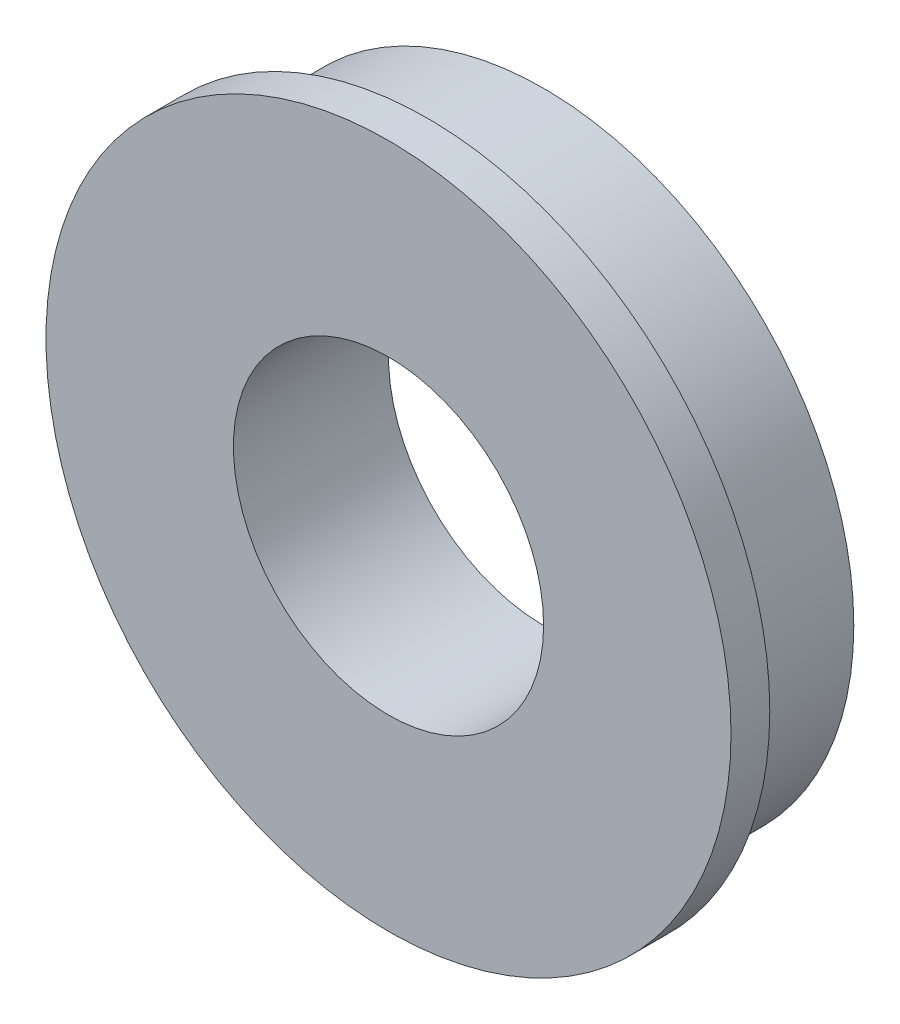
ISO-10303-21;
HEADER;
FILE_DESCRIPTION(('STEP AP214'),'2;1');
FILE_NAME('part.step','',(''),(''),'','','');
FILE_SCHEMA(('AUTOMOTIVE_DESIGN { 1 0 10303 214 1 1 1 1 }'));
ENDSEC;
DATA;
#1=APPLICATION_CONTEXT('core data for automotive mechanical design processes');
#2=APPLICATION_PROTOCOL_DEFINITION('international standard','automotive_design',2000,#1);
#3=PRODUCT_CONTEXT('',#1,'mechanical');
#4=PRODUCT('Part','Part','',(#3));
#5=PRODUCT_RELATED_PRODUCT_CATEGORY('part','',(#4));
#6=PRODUCT_DEFINITION_FORMATION('','',#4);
#7=PRODUCT_DEFINITION_CONTEXT('part definition',#1,'design');
#8=PRODUCT_DEFINITION('design','',#6,#7);
#9=PRODUCT_DEFINITION_SHAPE('','',#8);
#10=(LENGTH_UNIT() NAMED_UNIT(*) SI_UNIT(.MILLI.,.METRE.));
#11=(NAMED_UNIT(*) PLANE_ANGLE_UNIT() SI_UNIT($,.RADIAN.));
#12=(NAMED_UNIT(*) SI_UNIT($,.STERADIAN.) SOLID_ANGLE_UNIT());
#13=UNCERTAINTY_MEASURE_WITH_UNIT(LENGTH_MEASURE(1.E-05),#10,'distance_accuracy_value','');
#14=(GEOMETRIC_REPRESENTATION_CONTEXT(3) GLOBAL_UNCERTAINTY_ASSIGNED_CONTEXT((#13)) GLOBAL_UNIT_ASSIGNED_CONTEXT((#10,
#11,#12)) REPRESENTATION_CONTEXT('',''));
#15=CARTESIAN_POINT('',(0.,0.,0.));
#16=DIRECTION('',(0.,0.,1.));
#17=DIRECTION('',(1.,0.,0.));
#18=AXIS2_PLACEMENT_3D('',#15,#16,#17);
#19=CARTESIAN_POINT('',(-22.,0.,-4.5));
#20=DIRECTION('',(0.,0.,1.));
#21=DIRECTION('',(1.,0.,0.));
#22=AXIS2_PLACEMENT_3D('',#19,#20,#21);
#23=CYLINDRICAL_SURFACE('',#22,12.);
#24=CARTESIAN_POINT('',(-22.,0.,-4.5));
#25=DIRECTION('',(0.,0.,1.));
#26=DIRECTION('',(1.,0.,0.));
#27=AXIS2_PLACEMENT_3D('',#24,#25,#26);
#28=CIRCLE('',#27,12.);
#29=CARTESIAN_POINT('',(-9.99999999999999,0.,-4.5));
#30=VERTEX_POINT('',#29);
#31=EDGE_CURVE('E10',#30,#30,#28,.T.);
#32=ORIENTED_EDGE('',*,*,#31,.T.);
#33=EDGE_LOOP('',(#32));
#34=FACE_BOUND('',#33,.T.);
#35=CARTESIAN_POINT('',(-22.,0.,0.));
#36=DIRECTION('',(0.,0.,1.));
#37=DIRECTION('',(1.,0.,0.));
#38=AXIS2_PLACEMENT_3D('',#35,#36,#37);
#39=CIRCLE('',#38,12.);
#40=CARTESIAN_POINT('',(-9.99999999999999,0.,0.));
#41=VERTEX_POINT('',#40);
#42=EDGE_CURVE('E42',#41,#41,#39,.T.);
#43=ORIENTED_EDGE('',*,*,#42,.F.);
#44=EDGE_LOOP('',(#43));
#45=FACE_BOUND('',#44,.T.);
#46=ADVANCED_FACE('F36',(#34,#45),#23,.T.);
#47=CARTESIAN_POINT('',(-22.,0.,-4.5));
#48=DIRECTION('',(0.,0.,1.));
#49=DIRECTION('',(1.,0.,0.));
#50=AXIS2_PLACEMENT_3D('',#47,#48,#49);
#51=PLANE('',#50);
#52=CARTESIAN_POINT('',(-22.,0.,-4.5));
#53=DIRECTION('',(0.,0.,1.));
#54=DIRECTION('',(1.,0.,0.));
#55=AXIS2_PLACEMENT_3D('',#52,#53,#54);
#56=CIRCLE('',#55,6.);
#57=CARTESIAN_POINT('',(-16.,0.,-4.5));
#58=VERTEX_POINT('',#57);
#59=EDGE_CURVE('E55',#58,#58,#56,.T.);
#60=ORIENTED_EDGE('',*,*,#59,.T.);
#61=EDGE_LOOP('',(#60));
#62=FACE_BOUND('',#61,.T.);
#63=ORIENTED_EDGE('',*,*,#31,.F.);
#64=EDGE_LOOP('',(#63));
#65=FACE_BOUND('',#64,.T.);
#66=ADVANCED_FACE('F74',(#62,#65),#51,.F.);
#67=CARTESIAN_POINT('',(-22.,0.,1.5));
#68=DIRECTION('',(0.,0.,-1.));
#69=DIRECTION('',(-1.,0.,0.));
#70=AXIS2_PLACEMENT_3D('',#67,#68,#69);
#71=CYLINDRICAL_SURFACE('',#70,13.25);
#72=CARTESIAN_POINT('',(-22.,0.,1.5));
#73=DIRECTION('',(0.,0.,1.));
#74=DIRECTION('',(1.,0.,0.));
#75=AXIS2_PLACEMENT_3D('',#72,#73,#74);
#76=CIRCLE('',#75,13.25);
#77=CARTESIAN_POINT('',(-8.75,0.,1.5));
#78=VERTEX_POINT('',#77);
#79=EDGE_CURVE('E46',#78,#78,#76,.T.);
#80=ORIENTED_EDGE('',*,*,#79,.F.);
#81=EDGE_LOOP('',(#80));
#82=FACE_BOUND('',#81,.T.);
#83=CARTESIAN_POINT('',(-22.,0.,0.));
#84=DIRECTION('',(0.,0.,1.));
#85=DIRECTION('',(1.,0.,0.));
#86=AXIS2_PLACEMENT_3D('',#83,#84,#85);
#87=CIRCLE('',#86,13.25);
#88=CARTESIAN_POINT('',(-8.75,0.,0.));
#89=VERTEX_POINT('',#88);
#90=EDGE_CURVE('E50',#89,#89,#87,.T.);
#91=ORIENTED_EDGE('',*,*,#90,.T.);
#92=EDGE_LOOP('',(#91));
#93=FACE_BOUND('',#92,.T.);
#94=ADVANCED_FACE('F68',(#82,#93),#71,.T.);
#95=CARTESIAN_POINT('',(-22.,0.,1.5));
#96=DIRECTION('',(0.,0.,1.));
#97=DIRECTION('',(1.,0.,0.));
#98=AXIS2_PLACEMENT_3D('',#95,#96,#97);
#99=PLANE('',#98);
#100=CARTESIAN_POINT('',(-22.,0.,1.5));
#101=DIRECTION('',(0.,0.,1.));
#102=DIRECTION('',(1.,0.,0.));
#103=AXIS2_PLACEMENT_3D('',#100,#101,#102);
#104=CIRCLE('',#103,6.);
#105=CARTESIAN_POINT('',(-16.,0.,1.5));
#106=VERTEX_POINT('',#105);
#107=EDGE_CURVE('E58',#106,#106,#104,.T.);
#108=ORIENTED_EDGE('',*,*,#107,.F.);
#109=EDGE_LOOP('',(#108));
#110=FACE_BOUND('',#109,.T.);
#111=ORIENTED_EDGE('',*,*,#79,.T.);
#112=EDGE_LOOP('',(#111));
#113=FACE_BOUND('',#112,.T.);
#114=ADVANCED_FACE('F64',(#110,#113),#99,.T.);
#115=CARTESIAN_POINT('',(-22.,0.,0.));
#116=DIRECTION('',(0.,0.,1.));
#117=DIRECTION('',(1.,0.,0.));
#118=AXIS2_PLACEMENT_3D('',#115,#116,#117);
#119=PLANE('',#118);
#120=ORIENTED_EDGE('',*,*,#42,.T.);
#121=EDGE_LOOP('',(#120));
#122=FACE_BOUND('',#121,.T.);
#123=ORIENTED_EDGE('',*,*,#90,.F.);
#124=EDGE_LOOP('',(#123));
#125=FACE_BOUND('',#124,.T.);
#126=ADVANCED_FACE('F67',(#122,#125),#119,.F.);
#127=CARTESIAN_POINT('',(-22.,0.,-4.5));
#128=DIRECTION('',(0.,0.,1.));
#129=DIRECTION('',(1.,0.,0.));
#130=AXIS2_PLACEMENT_3D('',#127,#128,#129);
#131=CYLINDRICAL_SURFACE('',#130,6.);
#132=ORIENTED_EDGE('',*,*,#59,.F.);
#133=EDGE_LOOP('',(#132));
#134=FACE_BOUND('',#133,.T.);
#135=ORIENTED_EDGE('',*,*,#107,.T.);
#136=EDGE_LOOP('',(#135));
#137=FACE_BOUND('',#136,.T.);
#138=ADVANCED_FACE('F62',(#134,#137),#131,.F.);
#139=CLOSED_SHELL('',(#46,#66,#94,#114,#126,#138));
#140=MANIFOLD_SOLID_BREP('B2',#139);
#141=ADVANCED_BREP_SHAPE_REPRESENTATION('',(#18,#140),#14);
#142=SHAPE_DEFINITION_REPRESENTATION(#9,#141);
ENDSEC;
END-ISO-10303-21;
